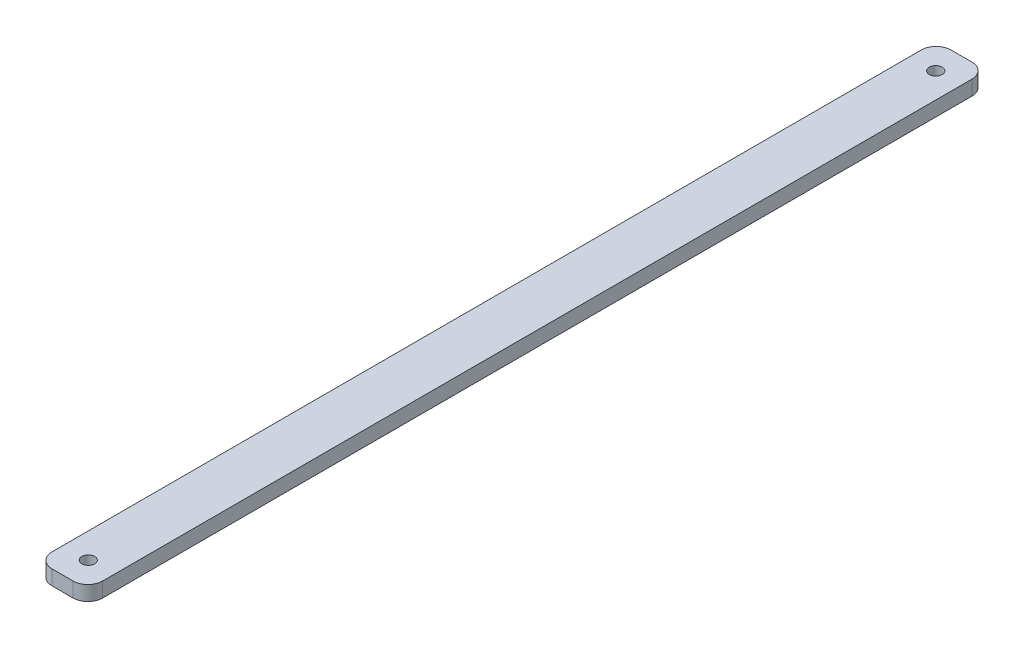
ISO-10303-21;
HEADER;
FILE_DESCRIPTION(('STEP AP214'),'2;1');
FILE_NAME('part.step','',(''),(''),'','','');
FILE_SCHEMA(('AUTOMOTIVE_DESIGN { 1 0 10303 214 1 1 1 1 }'));
ENDSEC;
DATA;
#1=APPLICATION_CONTEXT('core data for automotive mechanical design processes');
#2=APPLICATION_PROTOCOL_DEFINITION('international standard','automotive_design',2000,#1);
#3=PRODUCT_CONTEXT('',#1,'mechanical');
#4=PRODUCT('Part','Part','',(#3));
#5=PRODUCT_RELATED_PRODUCT_CATEGORY('part','',(#4));
#6=PRODUCT_DEFINITION_FORMATION('','',#4);
#7=PRODUCT_DEFINITION_CONTEXT('part definition',#1,'design');
#8=PRODUCT_DEFINITION('design','',#6,#7);
#9=PRODUCT_DEFINITION_SHAPE('','',#8);
#10=(LENGTH_UNIT() NAMED_UNIT(*) SI_UNIT(.MILLI.,.METRE.));
#11=(NAMED_UNIT(*) PLANE_ANGLE_UNIT() SI_UNIT($,.RADIAN.));
#12=(NAMED_UNIT(*) SI_UNIT($,.STERADIAN.) SOLID_ANGLE_UNIT());
#13=UNCERTAINTY_MEASURE_WITH_UNIT(LENGTH_MEASURE(1.E-05),#10,'distance_accuracy_value','');
#14=(GEOMETRIC_REPRESENTATION_CONTEXT(3) GLOBAL_UNCERTAINTY_ASSIGNED_CONTEXT((#13)) GLOBAL_UNIT_ASSIGNED_CONTEXT((#10,
#11,#12)) REPRESENTATION_CONTEXT('',''));
#15=CARTESIAN_POINT('',(0.,0.,0.));
#16=DIRECTION('',(0.,0.,1.));
#17=DIRECTION('',(1.,0.,0.));
#18=AXIS2_PLACEMENT_3D('',#15,#16,#17);
#19=CARTESIAN_POINT('',(0.,2.921,0.));
#20=DIRECTION('',(0.,1.,0.));
#21=DIRECTION('',(0.,0.,1.));
#22=AXIS2_PLACEMENT_3D('',#19,#20,#21);
#23=PLANE('',#22);
#24=CARTESIAN_POINT('',(0.,2.921,-83.8199999999999));
#25=DIRECTION('',(0.,1.,0.));
#26=DIRECTION('',(0.,0.,1.));
#27=AXIS2_PLACEMENT_3D('',#24,#25,#26);
#28=CIRCLE('',#27,1.27);
#29=CARTESIAN_POINT('',(0.,2.921,-82.5499999999999));
#30=VERTEX_POINT('',#29);
#31=EDGE_CURVE('E136',#30,#30,#28,.T.);
#32=ORIENTED_EDGE('',*,*,#31,.F.);
#33=EDGE_LOOP('',(#32));
#34=FACE_BOUND('',#33,.T.);
#35=DIRECTION('',(0.,0.,-1.));
#36=VECTOR('',#35,1.);
#37=CARTESIAN_POINT('',(4.99999999999999,2.921,-88.9));
#38=LINE('',#37,#36);
#39=CARTESIAN_POINT('',(5.00000000000001,2.921,85.979));
#40=VERTEX_POINT('',#39);
#41=CARTESIAN_POINT('',(4.99999999999999,2.921,-85.979));
#42=VERTEX_POINT('',#41);
#43=EDGE_CURVE('E141',#40,#42,#38,.T.);
#44=ORIENTED_EDGE('',*,*,#43,.T.);
#45=CARTESIAN_POINT('',(2.07899999999999,2.921,-85.979));
#46=DIRECTION('',(0.,1.,0.));
#47=DIRECTION('',(0.,0.,1.));
#48=AXIS2_PLACEMENT_3D('',#45,#46,#47);
#49=CIRCLE('',#48,2.921);
#50=CARTESIAN_POINT('',(2.07899999999999,2.921,-88.9));
#51=VERTEX_POINT('',#50);
#52=EDGE_CURVE('E156',#42,#51,#49,.T.);
#53=ORIENTED_EDGE('',*,*,#52,.T.);
#54=DIRECTION('',(-1.,0.,0.));
#55=VECTOR('',#54,1.);
#56=CARTESIAN_POINT('',(-5.00000000000001,2.921,-88.9));
#57=LINE('',#56,#55);
#58=CARTESIAN_POINT('',(-2.07900000000001,2.921,-88.9));
#59=VERTEX_POINT('',#58);
#60=EDGE_CURVE('E123',#51,#59,#57,.T.);
#61=ORIENTED_EDGE('',*,*,#60,.T.);
#62=CARTESIAN_POINT('',(-2.07900000000001,2.921,-85.979));
#63=DIRECTION('',(0.,1.,0.));
#64=DIRECTION('',(0.,0.,1.));
#65=AXIS2_PLACEMENT_3D('',#62,#63,#64);
#66=CIRCLE('',#65,2.921);
#67=CARTESIAN_POINT('',(-5.00000000000001,2.921,-85.979));
#68=VERTEX_POINT('',#67);
#69=EDGE_CURVE('E154',#59,#68,#66,.T.);
#70=ORIENTED_EDGE('',*,*,#69,.T.);
#71=DIRECTION('',(0.,0.,1.));
#72=VECTOR('',#71,1.);
#73=CARTESIAN_POINT('',(-5.00000000000001,2.921,-88.9));
#74=LINE('',#73,#72);
#75=CARTESIAN_POINT('',(-4.99999999999999,2.921,85.979));
#76=VERTEX_POINT('',#75);
#77=EDGE_CURVE('E167',#68,#76,#74,.T.);
#78=ORIENTED_EDGE('',*,*,#77,.T.);
#79=CARTESIAN_POINT('',(-2.07899999999999,2.921,85.979));
#80=DIRECTION('',(0.,1.,0.));
#81=DIRECTION('',(0.,0.,1.));
#82=AXIS2_PLACEMENT_3D('',#79,#80,#81);
#83=CIRCLE('',#82,2.921);
#84=CARTESIAN_POINT('',(-2.07899999999999,2.921,88.9));
#85=VERTEX_POINT('',#84);
#86=EDGE_CURVE('E58',#76,#85,#83,.T.);
#87=ORIENTED_EDGE('',*,*,#86,.T.);
#88=DIRECTION('',(1.,0.,0.));
#89=VECTOR('',#88,1.);
#90=CARTESIAN_POINT('',(-4.99999999999999,2.921,88.9));
#91=LINE('',#90,#89);
#92=CARTESIAN_POINT('',(2.07900000000001,2.921,88.9));
#93=VERTEX_POINT('',#92);
#94=EDGE_CURVE('E142',#85,#93,#91,.T.);
#95=ORIENTED_EDGE('',*,*,#94,.T.);
#96=CARTESIAN_POINT('',(2.07900000000001,2.921,85.979));
#97=DIRECTION('',(0.,1.,0.));
#98=DIRECTION('',(0.,0.,1.));
#99=AXIS2_PLACEMENT_3D('',#96,#97,#98);
#100=CIRCLE('',#99,2.921);
#101=EDGE_CURVE('E151',#93,#40,#100,.T.);
#102=ORIENTED_EDGE('',*,*,#101,.T.);
#103=EDGE_LOOP('',(#44,#53,#61,#70,#78,#87,#95,#102));
#104=FACE_BOUND('',#103,.T.);
#105=CARTESIAN_POINT('',(0.,2.921,83.8200000000001));
#106=DIRECTION('',(0.,1.,0.));
#107=DIRECTION('',(0.,0.,1.));
#108=AXIS2_PLACEMENT_3D('',#105,#106,#107);
#109=CIRCLE('',#108,1.27);
#110=CARTESIAN_POINT('',(0.,2.921,85.0900000000001));
#111=VERTEX_POINT('',#110);
#112=EDGE_CURVE('E184',#111,#111,#109,.T.);
#113=ORIENTED_EDGE('',*,*,#112,.F.);
#114=EDGE_LOOP('',(#113));
#115=FACE_BOUND('',#114,.T.);
#116=ADVANCED_FACE('F37',(#34,#104,#115),#23,.T.);
#117=CARTESIAN_POINT('',(0.,0.,0.));
#118=DIRECTION('',(0.,1.,0.));
#119=DIRECTION('',(0.,0.,1.));
#120=AXIS2_PLACEMENT_3D('',#117,#118,#119);
#121=PLANE('',#120);
#122=DIRECTION('',(-1.,0.,0.));
#123=VECTOR('',#122,1.);
#124=CARTESIAN_POINT('',(-5.00000000000001,0.,-88.9));
#125=LINE('',#124,#123);
#126=CARTESIAN_POINT('',(2.07899999999999,0.,-88.9));
#127=VERTEX_POINT('',#126);
#128=CARTESIAN_POINT('',(-2.07900000000001,0.,-88.9));
#129=VERTEX_POINT('',#128);
#130=EDGE_CURVE('E120',#127,#129,#125,.T.);
#131=ORIENTED_EDGE('',*,*,#130,.F.);
#132=CARTESIAN_POINT('',(2.07899999999999,0.,-85.979));
#133=DIRECTION('',(0.,1.,0.));
#134=DIRECTION('',(0.,0.,1.));
#135=AXIS2_PLACEMENT_3D('',#132,#133,#134);
#136=CIRCLE('',#135,2.921);
#137=CARTESIAN_POINT('',(4.99999999999999,0.,-85.979));
#138=VERTEX_POINT('',#137);
#139=EDGE_CURVE('E103',#127,#138,#136,.F.);
#140=ORIENTED_EDGE('',*,*,#139,.T.);
#141=DIRECTION('',(0.,0.,-1.));
#142=VECTOR('',#141,1.);
#143=CARTESIAN_POINT('',(4.99999999999999,0.,-88.9));
#144=LINE('',#143,#142);
#145=CARTESIAN_POINT('',(5.00000000000001,0.,85.979));
#146=VERTEX_POINT('',#145);
#147=EDGE_CURVE('E131',#146,#138,#144,.T.);
#148=ORIENTED_EDGE('',*,*,#147,.F.);
#149=CARTESIAN_POINT('',(2.07900000000001,0.,85.979));
#150=DIRECTION('',(0.,1.,0.));
#151=DIRECTION('',(0.,0.,1.));
#152=AXIS2_PLACEMENT_3D('',#149,#150,#151);
#153=CIRCLE('',#152,2.921);
#154=CARTESIAN_POINT('',(2.07900000000001,0.,88.9));
#155=VERTEX_POINT('',#154);
#156=EDGE_CURVE('E124',#146,#155,#153,.F.);
#157=ORIENTED_EDGE('',*,*,#156,.T.);
#158=DIRECTION('',(1.,0.,0.));
#159=VECTOR('',#158,1.);
#160=CARTESIAN_POINT('',(-4.99999999999999,0.,88.9));
#161=LINE('',#160,#159);
#162=CARTESIAN_POINT('',(-2.07899999999999,0.,88.9));
#163=VERTEX_POINT('',#162);
#164=EDGE_CURVE('E134',#163,#155,#161,.T.);
#165=ORIENTED_EDGE('',*,*,#164,.F.);
#166=CARTESIAN_POINT('',(-2.07899999999999,0.,85.979));
#167=DIRECTION('',(0.,1.,0.));
#168=DIRECTION('',(0.,0.,1.));
#169=AXIS2_PLACEMENT_3D('',#166,#167,#168);
#170=CIRCLE('',#169,2.921);
#171=CARTESIAN_POINT('',(-4.99999999999999,0.,85.979));
#172=VERTEX_POINT('',#171);
#173=EDGE_CURVE('E145',#163,#172,#170,.F.);
#174=ORIENTED_EDGE('',*,*,#173,.T.);
#175=DIRECTION('',(0.,0.,1.));
#176=VECTOR('',#175,1.);
#177=CARTESIAN_POINT('',(-5.00000000000001,0.,-88.9));
#178=LINE('',#177,#176);
#179=CARTESIAN_POINT('',(-5.00000000000001,0.,-85.979));
#180=VERTEX_POINT('',#179);
#181=EDGE_CURVE('E130',#180,#172,#178,.T.);
#182=ORIENTED_EDGE('',*,*,#181,.F.);
#183=CARTESIAN_POINT('',(-2.07900000000001,0.,-85.979));
#184=DIRECTION('',(0.,1.,0.));
#185=DIRECTION('',(0.,0.,1.));
#186=AXIS2_PLACEMENT_3D('',#183,#184,#185);
#187=CIRCLE('',#186,2.921);
#188=EDGE_CURVE('E114',#180,#129,#187,.F.);
#189=ORIENTED_EDGE('',*,*,#188,.T.);
#190=EDGE_LOOP('',(#131,#140,#148,#157,#165,#174,#182,#189));
#191=FACE_BOUND('',#190,.T.);
#192=CARTESIAN_POINT('',(0.,0.,-83.8199999999999));
#193=DIRECTION('',(0.,1.,0.));
#194=DIRECTION('',(0.,0.,1.));
#195=AXIS2_PLACEMENT_3D('',#192,#193,#194);
#196=CIRCLE('',#195,1.27);
#197=CARTESIAN_POINT('',(0.,0.,-82.5499999999999));
#198=VERTEX_POINT('',#197);
#199=EDGE_CURVE('E181',#198,#198,#196,.T.);
#200=ORIENTED_EDGE('',*,*,#199,.T.);
#201=EDGE_LOOP('',(#200));
#202=FACE_BOUND('',#201,.T.);
#203=CARTESIAN_POINT('',(0.,0.,83.8200000000001));
#204=DIRECTION('',(0.,1.,0.));
#205=DIRECTION('',(0.,0.,1.));
#206=AXIS2_PLACEMENT_3D('',#203,#204,#205);
#207=CIRCLE('',#206,1.27);
#208=CARTESIAN_POINT('',(0.,0.,85.0900000000001));
#209=VERTEX_POINT('',#208);
#210=EDGE_CURVE('E187',#209,#209,#207,.T.);
#211=ORIENTED_EDGE('',*,*,#210,.T.);
#212=EDGE_LOOP('',(#211));
#213=FACE_BOUND('',#212,.T.);
#214=ADVANCED_FACE('F127',(#191,#202,#213),#121,.F.);
#215=CARTESIAN_POINT('',(4.99999999999999,2.921,-88.9));
#216=DIRECTION('',(-1.,0.,0.));
#217=DIRECTION('',(0.,0.,1.));
#218=AXIS2_PLACEMENT_3D('',#215,#216,#217);
#219=PLANE('',#218);
#220=ORIENTED_EDGE('',*,*,#147,.T.);
#221=DIRECTION('',(0.,-1.,0.));
#222=VECTOR('',#221,1.);
#223=CARTESIAN_POINT('',(4.99999999999999,2.921,-85.979));
#224=LINE('',#223,#222);
#225=EDGE_CURVE('E108',#138,#42,#224,.F.);
#226=ORIENTED_EDGE('',*,*,#225,.T.);
#227=ORIENTED_EDGE('',*,*,#43,.F.);
#228=DIRECTION('',(0.,-1.,0.));
#229=VECTOR('',#228,1.);
#230=CARTESIAN_POINT('',(5.00000000000001,2.921,85.979));
#231=LINE('',#230,#229);
#232=EDGE_CURVE('E113',#40,#146,#231,.T.);
#233=ORIENTED_EDGE('',*,*,#232,.T.);
#234=EDGE_LOOP('',(#220,#226,#227,#233));
#235=FACE_BOUND('',#234,.T.);
#236=ADVANCED_FACE('F202',(#235),#219,.F.);
#237=CARTESIAN_POINT('',(-5.00000000000001,2.921,-88.9));
#238=DIRECTION('',(0.,0.,1.));
#239=DIRECTION('',(1.,0.,0.));
#240=AXIS2_PLACEMENT_3D('',#237,#238,#239);
#241=PLANE('',#240);
#242=ORIENTED_EDGE('',*,*,#60,.F.);
#243=DIRECTION('',(0.,-1.,0.));
#244=VECTOR('',#243,1.);
#245=CARTESIAN_POINT('',(2.07899999999999,2.921,-88.9));
#246=LINE('',#245,#244);
#247=EDGE_CURVE('E107',#51,#127,#246,.T.);
#248=ORIENTED_EDGE('',*,*,#247,.T.);
#249=ORIENTED_EDGE('',*,*,#130,.T.);
#250=DIRECTION('',(0.,-1.,0.));
#251=VECTOR('',#250,1.);
#252=CARTESIAN_POINT('',(-2.07900000000001,2.921,-88.9));
#253=LINE('',#252,#251);
#254=EDGE_CURVE('E125',#129,#59,#253,.F.);
#255=ORIENTED_EDGE('',*,*,#254,.T.);
#256=EDGE_LOOP('',(#242,#248,#249,#255));
#257=FACE_BOUND('',#256,.T.);
#258=ADVANCED_FACE('F119',(#257),#241,.F.);
#259=CARTESIAN_POINT('',(-5.00000000000001,2.921,-88.9));
#260=DIRECTION('',(1.,0.,0.));
#261=DIRECTION('',(0.,0.,-1.));
#262=AXIS2_PLACEMENT_3D('',#259,#260,#261);
#263=PLANE('',#262);
#264=ORIENTED_EDGE('',*,*,#77,.F.);
#265=DIRECTION('',(0.,-1.,0.));
#266=VECTOR('',#265,1.);
#267=CARTESIAN_POINT('',(-5.00000000000001,2.921,-85.979));
#268=LINE('',#267,#266);
#269=EDGE_CURVE('E160',#68,#180,#268,.T.);
#270=ORIENTED_EDGE('',*,*,#269,.T.);
#271=ORIENTED_EDGE('',*,*,#181,.T.);
#272=DIRECTION('',(0.,-1.,0.));
#273=VECTOR('',#272,1.);
#274=CARTESIAN_POINT('',(-4.99999999999999,2.921,85.979));
#275=LINE('',#274,#273);
#276=EDGE_CURVE('E158',#172,#76,#275,.F.);
#277=ORIENTED_EDGE('',*,*,#276,.T.);
#278=EDGE_LOOP('',(#264,#270,#271,#277));
#279=FACE_BOUND('',#278,.T.);
#280=ADVANCED_FACE('F165',(#279),#263,.F.);
#281=CARTESIAN_POINT('',(-4.99999999999999,2.921,88.9));
#282=DIRECTION('',(0.,0.,-1.));
#283=DIRECTION('',(-1.,0.,0.));
#284=AXIS2_PLACEMENT_3D('',#281,#282,#283);
#285=PLANE('',#284);
#286=ORIENTED_EDGE('',*,*,#94,.F.);
#287=DIRECTION('',(0.,-1.,0.));
#288=VECTOR('',#287,1.);
#289=CARTESIAN_POINT('',(-2.07899999999999,2.921,88.9));
#290=LINE('',#289,#288);
#291=EDGE_CURVE('E11',#85,#163,#290,.T.);
#292=ORIENTED_EDGE('',*,*,#291,.T.);
#293=ORIENTED_EDGE('',*,*,#164,.T.);
#294=DIRECTION('',(0.,-1.,0.));
#295=VECTOR('',#294,1.);
#296=CARTESIAN_POINT('',(2.07900000000001,2.921,88.9));
#297=LINE('',#296,#295);
#298=EDGE_CURVE('E45',#155,#93,#297,.F.);
#299=ORIENTED_EDGE('',*,*,#298,.T.);
#300=EDGE_LOOP('',(#286,#292,#293,#299));
#301=FACE_BOUND('',#300,.T.);
#302=ADVANCED_FACE('F174',(#301),#285,.F.);
#303=CARTESIAN_POINT('',(0.,2.921,-83.8199999999999));
#304=DIRECTION('',(0.,-1.,0.));
#305=DIRECTION('',(0.,0.,-1.));
#306=AXIS2_PLACEMENT_3D('',#303,#304,#305);
#307=CYLINDRICAL_SURFACE('',#306,1.27);
#308=ORIENTED_EDGE('',*,*,#31,.T.);
#309=EDGE_LOOP('',(#308));
#310=FACE_BOUND('',#309,.T.);
#311=ORIENTED_EDGE('',*,*,#199,.F.);
#312=EDGE_LOOP('',(#311));
#313=FACE_BOUND('',#312,.T.);
#314=ADVANCED_FACE('F206',(#310,#313),#307,.F.);
#315=CARTESIAN_POINT('',(0.,2.921,83.8200000000001));
#316=DIRECTION('',(0.,-1.,0.));
#317=DIRECTION('',(0.,0.,-1.));
#318=AXIS2_PLACEMENT_3D('',#315,#316,#317);
#319=CYLINDRICAL_SURFACE('',#318,1.27);
#320=ORIENTED_EDGE('',*,*,#112,.T.);
#321=EDGE_LOOP('',(#320));
#322=FACE_BOUND('',#321,.T.);
#323=ORIENTED_EDGE('',*,*,#210,.F.);
#324=EDGE_LOOP('',(#323));
#325=FACE_BOUND('',#324,.T.);
#326=ADVANCED_FACE('F193',(#322,#325),#319,.F.);
#327=CARTESIAN_POINT('',(2.07899999999999,2.921,-85.979));
#328=DIRECTION('',(0.,-1.,0.));
#329=DIRECTION('',(0.,0.,-1.));
#330=AXIS2_PLACEMENT_3D('',#327,#328,#329);
#331=CYLINDRICAL_SURFACE('',#330,2.921);
#332=ORIENTED_EDGE('',*,*,#52,.F.);
#333=ORIENTED_EDGE('',*,*,#225,.F.);
#334=ORIENTED_EDGE('',*,*,#139,.F.);
#335=ORIENTED_EDGE('',*,*,#247,.F.);
#336=EDGE_LOOP('',(#332,#333,#334,#335));
#337=FACE_BOUND('',#336,.T.);
#338=ADVANCED_FACE('F106',(#337),#331,.T.);
#339=CARTESIAN_POINT('',(-2.07900000000001,2.921,-85.979));
#340=DIRECTION('',(0.,-1.,0.));
#341=DIRECTION('',(0.,0.,-1.));
#342=AXIS2_PLACEMENT_3D('',#339,#340,#341);
#343=CYLINDRICAL_SURFACE('',#342,2.921);
#344=ORIENTED_EDGE('',*,*,#69,.F.);
#345=ORIENTED_EDGE('',*,*,#254,.F.);
#346=ORIENTED_EDGE('',*,*,#188,.F.);
#347=ORIENTED_EDGE('',*,*,#269,.F.);
#348=EDGE_LOOP('',(#344,#345,#346,#347));
#349=FACE_BOUND('',#348,.T.);
#350=ADVANCED_FACE('F220',(#349),#343,.T.);
#351=CARTESIAN_POINT('',(-2.07899999999999,2.921,85.979));
#352=DIRECTION('',(0.,-1.,0.));
#353=DIRECTION('',(0.,0.,-1.));
#354=AXIS2_PLACEMENT_3D('',#351,#352,#353);
#355=CYLINDRICAL_SURFACE('',#354,2.921);
#356=ORIENTED_EDGE('',*,*,#86,.F.);
#357=ORIENTED_EDGE('',*,*,#276,.F.);
#358=ORIENTED_EDGE('',*,*,#173,.F.);
#359=ORIENTED_EDGE('',*,*,#291,.F.);
#360=EDGE_LOOP('',(#356,#357,#358,#359));
#361=FACE_BOUND('',#360,.T.);
#362=ADVANCED_FACE('F173',(#361),#355,.T.);
#363=CARTESIAN_POINT('',(2.07900000000001,2.921,85.979));
#364=DIRECTION('',(0.,-1.,0.));
#365=DIRECTION('',(0.,0.,-1.));
#366=AXIS2_PLACEMENT_3D('',#363,#364,#365);
#367=CYLINDRICAL_SURFACE('',#366,2.921);
#368=ORIENTED_EDGE('',*,*,#101,.F.);
#369=ORIENTED_EDGE('',*,*,#298,.F.);
#370=ORIENTED_EDGE('',*,*,#156,.F.);
#371=ORIENTED_EDGE('',*,*,#232,.F.);
#372=EDGE_LOOP('',(#368,#369,#370,#371));
#373=FACE_BOUND('',#372,.T.);
#374=ADVANCED_FACE('F39',(#373),#367,.T.);
#375=CLOSED_SHELL('',(#116,#214,#236,#258,#280,#302,#314,#326,#338,#350,#362,#374));
#376=MANIFOLD_SOLID_BREP('B2',#375);
#377=ADVANCED_BREP_SHAPE_REPRESENTATION('',(#18,#376),#14);
#378=SHAPE_DEFINITION_REPRESENTATION(#9,#377);
ENDSEC;
END-ISO-10303-21;
